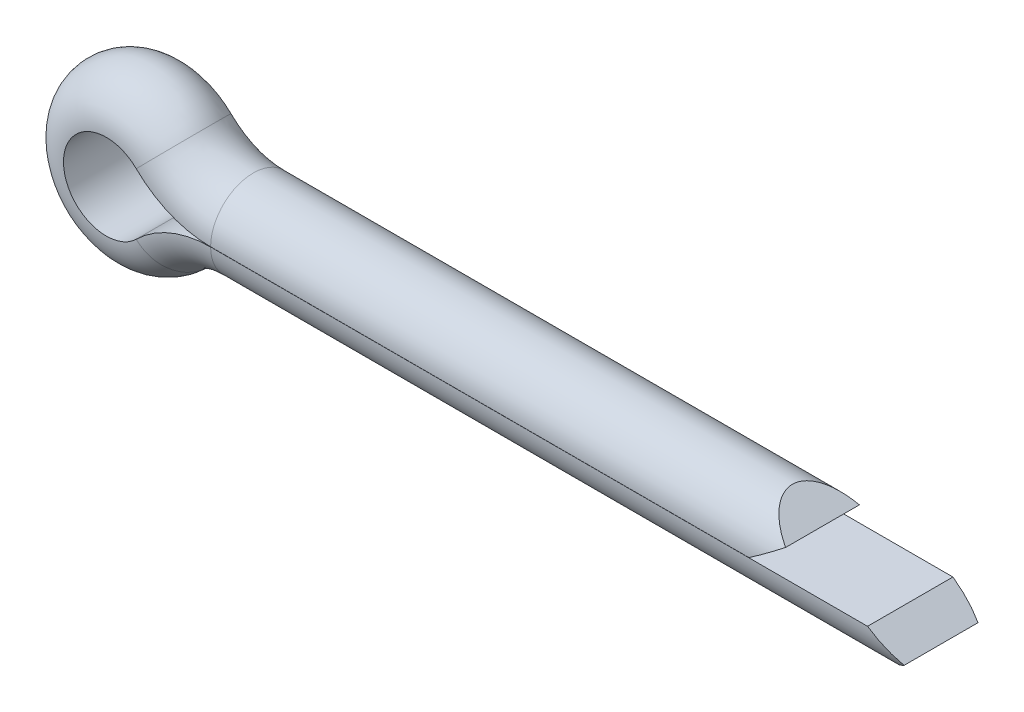
ISO-10303-21;
HEADER;
FILE_DESCRIPTION(('STEP AP214'),'2;1');
FILE_NAME('part.step','',(''),(''),'','','');
FILE_SCHEMA(('AUTOMOTIVE_DESIGN { 1 0 10303 214 1 1 1 1 }'));
ENDSEC;
DATA;
#1=APPLICATION_CONTEXT('core data for automotive mechanical design processes');
#2=APPLICATION_PROTOCOL_DEFINITION('international standard','automotive_design',2000,#1);
#3=PRODUCT_CONTEXT('',#1,'mechanical');
#4=PRODUCT('Part','Part','',(#3));
#5=PRODUCT_RELATED_PRODUCT_CATEGORY('part','',(#4));
#6=PRODUCT_DEFINITION_FORMATION('','',#4);
#7=PRODUCT_DEFINITION_CONTEXT('part definition',#1,'design');
#8=PRODUCT_DEFINITION('design','',#6,#7);
#9=PRODUCT_DEFINITION_SHAPE('','',#8);
#10=(LENGTH_UNIT() NAMED_UNIT(*) SI_UNIT(.MILLI.,.METRE.));
#11=(NAMED_UNIT(*) PLANE_ANGLE_UNIT() SI_UNIT($,.RADIAN.));
#12=(NAMED_UNIT(*) SI_UNIT($,.STERADIAN.) SOLID_ANGLE_UNIT());
#13=UNCERTAINTY_MEASURE_WITH_UNIT(LENGTH_MEASURE(1.E-05),#10,'distance_accuracy_value','');
#14=(GEOMETRIC_REPRESENTATION_CONTEXT(3) GLOBAL_UNCERTAINTY_ASSIGNED_CONTEXT((#13)) GLOBAL_UNIT_ASSIGNED_CONTEXT((#10,
#11,#12)) REPRESENTATION_CONTEXT('',''));
#15=CARTESIAN_POINT('',(0.,0.,0.));
#16=DIRECTION('',(0.,0.,1.));
#17=DIRECTION('',(1.,0.,0.));
#18=AXIS2_PLACEMENT_3D('',#15,#16,#17);
#19=CARTESIAN_POINT('',(0.,-0.00200000000000005,0.899997777775034));
#20=DIRECTION('',(0.,-1.,0.));
#21=DIRECTION('',(1.,0.,0.));
#22=AXIS2_PLACEMENT_3D('',#19,#20,#21);
#23=PLANE('',#22);
#24=DIRECTION('',(1.,0.,0.));
#25=VECTOR('',#24,1.);
#26=CARTESIAN_POINT('',(0.,-0.00200000000000005,0.899997777775034));
#27=LINE('',#26,#25);
#28=CARTESIAN_POINT('',(0.,-0.00200000000000005,0.899997777775034));
#29=VERTEX_POINT('',#28);
#30=CARTESIAN_POINT('',(13.8502858763282,-0.00200000000000167,0.899997777775034));
#31=VERTEX_POINT('',#30);
#32=EDGE_CURVE('E40',#29,#31,#27,.T.);
#33=ORIENTED_EDGE('',*,*,#32,.T.);
#34=DIRECTION('',(0.,0.,-1.));
#35=VECTOR('',#34,1.);
#36=CARTESIAN_POINT('',(13.8502858763282,-0.00200000000000026,0.899997777775034));
#37=LINE('',#36,#35);
#38=CARTESIAN_POINT('',(13.8502858763282,-0.00200000000000167,-0.899997777775034));
#39=VERTEX_POINT('',#38);
#40=EDGE_CURVE('E96',#31,#39,#37,.T.);
#41=ORIENTED_EDGE('',*,*,#40,.T.);
#42=DIRECTION('',(1.,0.,0.));
#43=VECTOR('',#42,1.);
#44=CARTESIAN_POINT('',(0.,-0.00200000000000005,-0.899997777775034));
#45=LINE('',#44,#43);
#46=CARTESIAN_POINT('',(0.,-0.00200000000000005,-0.899997777775034));
#47=VERTEX_POINT('',#46);
#48=EDGE_CURVE('E11',#47,#39,#45,.T.);
#49=ORIENTED_EDGE('',*,*,#48,.F.);
#50=DIRECTION('',(0.,0.,-1.));
#51=VECTOR('',#50,1.);
#52=CARTESIAN_POINT('',(0.,-0.00200000000000005,0.899997777775034));
#53=LINE('',#52,#51);
#54=EDGE_CURVE('E113',#29,#47,#53,.T.);
#55=ORIENTED_EDGE('',*,*,#54,.F.);
#56=EDGE_LOOP('',(#33,#41,#49,#55));
#57=FACE_BOUND('',#56,.T.);
#58=ADVANCED_FACE('F33',(#57),#23,.F.);
#59=CARTESIAN_POINT('',(0.,0.,0.));
#60=DIRECTION('',(1.,0.,0.));
#61=DIRECTION('',(0.,1.,0.));
#62=AXIS2_PLACEMENT_3D('',#59,#60,#61);
#63=CYLINDRICAL_SURFACE('',#62,0.9);
#64=CARTESIAN_POINT('',(15.1357297109468,0.,0.));
#65=DIRECTION('',(-0.578607904277823,0.815605844208601,0.));
#66=DIRECTION('',(0.815605844208601,0.578607904277824,0.));
#67=AXIS2_PLACEMENT_3D('',#64,#65,#66);
#68=ELLIPSE('',#67,1.55545749262329,0.9);
#69=CARTESIAN_POINT('',(14.5,-0.450999999999998,-0.778844657168554));
#70=VERTEX_POINT('',#69);
#71=CARTESIAN_POINT('',(14.5,-0.451,0.778844657168554));
#72=VERTEX_POINT('',#71);
#73=EDGE_CURVE('E110',#70,#72,#68,.T.);
#74=ORIENTED_EDGE('',*,*,#73,.T.);
#75=CARTESIAN_POINT('',(13.8473918267795,0.,0.));
#76=DIRECTION('',(-0.568523234922219,-0.822667205711748,0.));
#77=DIRECTION('',(0.822667205711748,-0.568523234922219,0.));
#78=AXIS2_PLACEMENT_3D('',#75,#76,#77);
#79=ELLIPSE('',#78,1.58304875635053,0.9);
#80=EDGE_CURVE('E99',#72,#31,#79,.T.);
#81=ORIENTED_EDGE('',*,*,#80,.T.);
#82=ORIENTED_EDGE('',*,*,#32,.F.);
#83=CARTESIAN_POINT('',(0.,0.,0.));
#84=DIRECTION('',(-1.,0.,0.));
#85=DIRECTION('',(0.,0.,-1.));
#86=AXIS2_PLACEMENT_3D('',#83,#84,#85);
#87=CIRCLE('',#86,0.9);
#88=EDGE_CURVE('E123',#47,#29,#87,.T.);
#89=ORIENTED_EDGE('',*,*,#88,.F.);
#90=ORIENTED_EDGE('',*,*,#48,.T.);
#91=EDGE_CURVE('E101',#39,#70,#79,.T.);
#92=ORIENTED_EDGE('',*,*,#91,.T.);
#93=EDGE_LOOP('',(#74,#81,#82,#89,#90,#92));
#94=FACE_BOUND('',#93,.T.);
#95=ADVANCED_FACE('F107',(#94),#63,.T.);
#96=CARTESIAN_POINT('',(0.,-2.23888888888889,0.));
#97=DIRECTION('',(0.,0.,-1.));
#98=DIRECTION('',(-1.,0.,0.));
#99=AXIS2_PLACEMENT_3D('',#96,#97,#98);
#100=CYLINDRICAL_SURFACE('',#99,2.23688888888889);
#101=DIRECTION('',(0.,0.,-1.));
#102=VECTOR('',#101,1.);
#103=CARTESIAN_POINT('',(-1.5678017699115,-0.643373451327425,0.899997777775034));
#104=LINE('',#103,#102);
#105=CARTESIAN_POINT('',(-1.5678017699115,-0.643373451327425,0.899997777775034));
#106=VERTEX_POINT('',#105);
#107=CARTESIAN_POINT('',(-1.5678017699115,-0.643373451327425,-0.899997777775034));
#108=VERTEX_POINT('',#107);
#109=EDGE_CURVE('E131',#106,#108,#104,.T.);
#110=ORIENTED_EDGE('',*,*,#109,.F.);
#111=CARTESIAN_POINT('',(0.,-2.23888888888889,0.899997777775034));
#112=DIRECTION('',(0.,0.,-1.));
#113=DIRECTION('',(-1.,0.,0.));
#114=AXIS2_PLACEMENT_3D('',#111,#112,#113);
#115=CIRCLE('',#114,2.23688888888889);
#116=EDGE_CURVE('E117',#106,#29,#115,.T.);
#117=ORIENTED_EDGE('',*,*,#116,.T.);
#118=ORIENTED_EDGE('',*,*,#54,.T.);
#119=CARTESIAN_POINT('',(0.,-2.23888888888889,-0.899997777775034));
#120=DIRECTION('',(0.,0.,-1.));
#121=DIRECTION('',(-1.,0.,0.));
#122=AXIS2_PLACEMENT_3D('',#119,#120,#121);
#123=CIRCLE('',#122,2.23688888888889);
#124=EDGE_CURVE('E115',#108,#47,#123,.T.);
#125=ORIENTED_EDGE('',*,*,#124,.F.);
#126=EDGE_LOOP('',(#110,#117,#118,#125));
#127=FACE_BOUND('',#126,.T.);
#128=ADVANCED_FACE('F196',(#127),#100,.T.);
#129=CARTESIAN_POINT('',(0.,-2.23888888888889,0.));
#130=DIRECTION('',(0.,0.,-1.));
#131=DIRECTION('',(-1.,0.,0.));
#132=AXIS2_PLACEMENT_3D('',#129,#130,#131);
#133=TOROIDAL_SURFACE('',#132,2.23888888888889,0.9);
#134=CARTESIAN_POINT('',(-1.569203539823,-0.641946902654858,0.));
#135=DIRECTION('',(-0.713274336283177,-0.700884955752222,0.));
#136=DIRECTION('',(0.,0.,-1.));
#137=AXIS2_PLACEMENT_3D('',#134,#135,#136);
#138=CIRCLE('',#137,0.9);
#139=EDGE_CURVE('E134',#108,#106,#138,.T.);
#140=ORIENTED_EDGE('',*,*,#139,.F.);
#141=ORIENTED_EDGE('',*,*,#124,.T.);
#142=ORIENTED_EDGE('',*,*,#88,.T.);
#143=ORIENTED_EDGE('',*,*,#116,.F.);
#144=EDGE_LOOP('',(#140,#141,#142,#143));
#145=FACE_BOUND('',#144,.T.);
#146=ADVANCED_FACE('F198',(#145),#133,.T.);
#147=CARTESIAN_POINT('',(-2.2,0.,0.));
#148=DIRECTION('',(0.,0.,1.));
#149=DIRECTION('',(1.,0.,0.));
#150=AXIS2_PLACEMENT_3D('',#147,#148,#149);
#151=CYLINDRICAL_SURFACE('',#150,0.902);
#152=DIRECTION('',(0.,0.,-1.));
#153=VECTOR('',#152,1.);
#154=CARTESIAN_POINT('',(-1.5678017699115,0.643373451327434,0.899997777775034));
#155=LINE('',#154,#153);
#156=CARTESIAN_POINT('',(-1.5678017699115,0.643373451327434,0.899997777775034));
#157=VERTEX_POINT('',#156);
#158=CARTESIAN_POINT('',(-1.5678017699115,0.643373451327434,-0.899997777775034));
#159=VERTEX_POINT('',#158);
#160=EDGE_CURVE('E143',#157,#159,#155,.T.);
#161=ORIENTED_EDGE('',*,*,#160,.F.);
#162=CARTESIAN_POINT('',(-2.2,0.,0.899997777775034));
#163=DIRECTION('',(0.,0.,1.));
#164=DIRECTION('',(1.,0.,0.));
#165=AXIS2_PLACEMENT_3D('',#162,#163,#164);
#166=CIRCLE('',#165,0.902);
#167=EDGE_CURVE('E128',#157,#106,#166,.T.);
#168=ORIENTED_EDGE('',*,*,#167,.T.);
#169=ORIENTED_EDGE('',*,*,#109,.T.);
#170=CARTESIAN_POINT('',(-2.2,0.,-0.899997777775034));
#171=DIRECTION('',(0.,0.,1.));
#172=DIRECTION('',(1.,0.,0.));
#173=AXIS2_PLACEMENT_3D('',#170,#171,#172);
#174=CIRCLE('',#173,0.902);
#175=EDGE_CURVE('E125',#159,#108,#174,.T.);
#176=ORIENTED_EDGE('',*,*,#175,.F.);
#177=EDGE_LOOP('',(#161,#168,#169,#176));
#178=FACE_BOUND('',#177,.T.);
#179=ADVANCED_FACE('F193',(#178),#151,.F.);
#180=CARTESIAN_POINT('',(-2.2,0.,0.));
#181=DIRECTION('',(0.,0.,1.));
#182=DIRECTION('',(1.,0.,0.));
#183=AXIS2_PLACEMENT_3D('',#180,#181,#182);
#184=TOROIDAL_SURFACE('',#183,0.9,0.9);
#185=CARTESIAN_POINT('',(-1.56920353982301,0.641946902654868,0.));
#186=DIRECTION('',(0.713274336283185,-0.700884955752213,0.));
#187=DIRECTION('',(0.,0.,-1.));
#188=AXIS2_PLACEMENT_3D('',#185,#186,#187);
#189=CIRCLE('',#188,0.9);
#190=EDGE_CURVE('E146',#159,#157,#189,.T.);
#191=ORIENTED_EDGE('',*,*,#190,.F.);
#192=ORIENTED_EDGE('',*,*,#175,.T.);
#193=ORIENTED_EDGE('',*,*,#139,.T.);
#194=ORIENTED_EDGE('',*,*,#167,.F.);
#195=EDGE_LOOP('',(#191,#192,#193,#194));
#196=FACE_BOUND('',#195,.T.);
#197=ADVANCED_FACE('F190',(#196),#184,.T.);
#198=CARTESIAN_POINT('',(0.,2.23888888888889,0.));
#199=DIRECTION('',(0.,0.,-1.));
#200=DIRECTION('',(-1.,0.,0.));
#201=AXIS2_PLACEMENT_3D('',#198,#199,#200);
#202=CYLINDRICAL_SURFACE('',#201,2.23688888888889);
#203=DIRECTION('',(0.,0.,-1.));
#204=VECTOR('',#203,1.);
#205=CARTESIAN_POINT('',(0.,0.002,0.899997777775034));
#206=LINE('',#205,#204);
#207=CARTESIAN_POINT('',(0.,0.002,0.899997777775034));
#208=VERTEX_POINT('',#207);
#209=CARTESIAN_POINT('',(0.,0.002,-0.899997777775034));
#210=VERTEX_POINT('',#209);
#211=EDGE_CURVE('E153',#208,#210,#206,.T.);
#212=ORIENTED_EDGE('',*,*,#211,.F.);
#213=CARTESIAN_POINT('',(0.,2.23888888888889,0.899997777775034));
#214=DIRECTION('',(0.,0.,-1.));
#215=DIRECTION('',(-1.,0.,0.));
#216=AXIS2_PLACEMENT_3D('',#213,#214,#215);
#217=CIRCLE('',#216,2.23688888888889);
#218=EDGE_CURVE('E140',#208,#157,#217,.T.);
#219=ORIENTED_EDGE('',*,*,#218,.T.);
#220=ORIENTED_EDGE('',*,*,#160,.T.);
#221=CARTESIAN_POINT('',(0.,2.23888888888889,-0.899997777775034));
#222=DIRECTION('',(0.,0.,-1.));
#223=DIRECTION('',(-1.,0.,0.));
#224=AXIS2_PLACEMENT_3D('',#221,#222,#223);
#225=CIRCLE('',#224,2.23688888888889);
#226=EDGE_CURVE('E137',#210,#159,#225,.T.);
#227=ORIENTED_EDGE('',*,*,#226,.F.);
#228=EDGE_LOOP('',(#212,#219,#220,#227));
#229=FACE_BOUND('',#228,.T.);
#230=ADVANCED_FACE('F184',(#229),#202,.T.);
#231=CARTESIAN_POINT('',(0.,2.23888888888889,0.));
#232=DIRECTION('',(0.,0.,-1.));
#233=DIRECTION('',(-1.,0.,0.));
#234=AXIS2_PLACEMENT_3D('',#231,#232,#233);
#235=TOROIDAL_SURFACE('',#234,2.23888888888889,0.9);
#236=CARTESIAN_POINT('',(0.,0.,0.));
#237=DIRECTION('',(1.,0.,0.));
#238=DIRECTION('',(0.,0.,-1.));
#239=AXIS2_PLACEMENT_3D('',#236,#237,#238);
#240=CIRCLE('',#239,0.9);
#241=EDGE_CURVE('E158',#210,#208,#240,.T.);
#242=ORIENTED_EDGE('',*,*,#241,.F.);
#243=ORIENTED_EDGE('',*,*,#226,.T.);
#244=ORIENTED_EDGE('',*,*,#190,.T.);
#245=ORIENTED_EDGE('',*,*,#218,.F.);
#246=EDGE_LOOP('',(#242,#243,#244,#245));
#247=FACE_BOUND('',#246,.T.);
#248=ADVANCED_FACE('F187',(#247),#235,.T.);
#249=CARTESIAN_POINT('',(0.,0.,0.));
#250=DIRECTION('',(1.,0.,0.));
#251=DIRECTION('',(0.,0.,-1.));
#252=AXIS2_PLACEMENT_3D('',#249,#250,#251);
#253=CYLINDRICAL_SURFACE('',#252,0.9);
#254=CARTESIAN_POINT('',(11.3473918267795,0.,0.));
#255=DIRECTION('',(-0.568523234922219,0.822667205711748,0.));
#256=DIRECTION('',(0.822667205711748,0.568523234922219,0.));
#257=AXIS2_PLACEMENT_3D('',#254,#255,#256);
#258=ELLIPSE('',#257,1.58304875635053,0.9);
#259=CARTESIAN_POINT('',(12.,0.451,0.778844657168553));
#260=VERTEX_POINT('',#259);
#261=CARTESIAN_POINT('',(11.3502858763282,0.002,0.899997777775034));
#262=VERTEX_POINT('',#261);
#263=EDGE_CURVE('E47',#260,#262,#258,.F.);
#264=ORIENTED_EDGE('',*,*,#263,.F.);
#265=CARTESIAN_POINT('',(12.6357297109468,0.,0.));
#266=DIRECTION('',(-0.578607904277824,-0.815605844208601,0.));
#267=DIRECTION('',(0.815605844208601,-0.578607904277824,0.));
#268=AXIS2_PLACEMENT_3D('',#265,#266,#267);
#269=ELLIPSE('',#268,1.55545749262329,0.9);
#270=CARTESIAN_POINT('',(12.,0.451,-0.778844657168553));
#271=VERTEX_POINT('',#270);
#272=EDGE_CURVE('E166',#271,#260,#269,.F.);
#273=ORIENTED_EDGE('',*,*,#272,.F.);
#274=CARTESIAN_POINT('',(11.3502858763282,0.00200000000000013,-0.899997777775034));
#275=VERTEX_POINT('',#274);
#276=EDGE_CURVE('E162',#275,#271,#258,.F.);
#277=ORIENTED_EDGE('',*,*,#276,.F.);
#278=DIRECTION('',(1.,0.,0.));
#279=VECTOR('',#278,1.);
#280=CARTESIAN_POINT('',(0.,0.002,-0.899997777775034));
#281=LINE('',#280,#279);
#282=EDGE_CURVE('E149',#210,#275,#281,.T.);
#283=ORIENTED_EDGE('',*,*,#282,.F.);
#284=ORIENTED_EDGE('',*,*,#241,.T.);
#285=DIRECTION('',(1.,0.,0.));
#286=VECTOR('',#285,1.);
#287=CARTESIAN_POINT('',(0.,0.002,0.899997777775034));
#288=LINE('',#287,#286);
#289=EDGE_CURVE('E150',#208,#262,#288,.T.);
#290=ORIENTED_EDGE('',*,*,#289,.T.);
#291=EDGE_LOOP('',(#264,#273,#277,#283,#284,#290));
#292=FACE_BOUND('',#291,.T.);
#293=ADVANCED_FACE('F176',(#292),#253,.T.);
#294=CARTESIAN_POINT('',(0.,0.002,0.899997777775034));
#295=DIRECTION('',(0.,-1.,0.));
#296=DIRECTION('',(0.,0.,-1.));
#297=AXIS2_PLACEMENT_3D('',#294,#295,#296);
#298=PLANE('',#297);
#299=DIRECTION('',(0.,0.,-1.));
#300=VECTOR('',#299,1.);
#301=CARTESIAN_POINT('',(11.3502858763281,0.002,0.899997777775034));
#302=LINE('',#301,#300);
#303=EDGE_CURVE('E164',#262,#275,#302,.T.);
#304=ORIENTED_EDGE('',*,*,#303,.F.);
#305=ORIENTED_EDGE('',*,*,#289,.F.);
#306=ORIENTED_EDGE('',*,*,#211,.T.);
#307=ORIENTED_EDGE('',*,*,#282,.T.);
#308=EDGE_LOOP('',(#304,#305,#306,#307));
#309=FACE_BOUND('',#308,.T.);
#310=ADVANCED_FACE('F181',(#309),#298,.T.);
#311=CARTESIAN_POINT('',(12.,0.451,-0.899997777775034));
#312=DIRECTION('',(-0.568523234922219,0.822667205711748,0.));
#313=DIRECTION('',(-0.822667205711748,-0.568523234922219,0.));
#314=AXIS2_PLACEMENT_3D('',#311,#312,#313);
#315=PLANE('',#314);
#316=ORIENTED_EDGE('',*,*,#263,.T.);
#317=ORIENTED_EDGE('',*,*,#303,.T.);
#318=ORIENTED_EDGE('',*,*,#276,.T.);
#319=DIRECTION('',(0.,0.,1.));
#320=VECTOR('',#319,1.);
#321=CARTESIAN_POINT('',(12.,0.451,-0.899997777775034));
#322=LINE('',#321,#320);
#323=EDGE_CURVE('E168',#271,#260,#322,.T.);
#324=ORIENTED_EDGE('',*,*,#323,.T.);
#325=EDGE_LOOP('',(#316,#317,#318,#324));
#326=FACE_BOUND('',#325,.T.);
#327=ADVANCED_FACE('F171',(#326),#315,.F.);
#328=CARTESIAN_POINT('',(12.,0.451,-0.899997777775034));
#329=DIRECTION('',(-0.578607904277824,-0.815605844208601,0.));
#330=DIRECTION('',(0.815605844208601,-0.578607904277824,0.));
#331=AXIS2_PLACEMENT_3D('',#328,#329,#330);
#332=PLANE('',#331);
#333=ORIENTED_EDGE('',*,*,#272,.T.);
#334=ORIENTED_EDGE('',*,*,#323,.F.);
#335=EDGE_LOOP('',(#333,#334));
#336=FACE_BOUND('',#335,.T.);
#337=ADVANCED_FACE('F277',(#336),#332,.F.);
#338=CARTESIAN_POINT('',(14.5,-0.451,-0.899997777775034));
#339=DIRECTION('',(-0.578607904277823,0.815605844208601,0.));
#340=DIRECTION('',(-0.815605844208601,-0.578607904277824,0.));
#341=AXIS2_PLACEMENT_3D('',#338,#339,#340);
#342=PLANE('',#341);
#343=DIRECTION('',(0.,0.,1.));
#344=VECTOR('',#343,1.);
#345=CARTESIAN_POINT('',(14.5,-0.451,-0.899997777775034));
#346=LINE('',#345,#344);
#347=EDGE_CURVE('E55',#70,#72,#346,.T.);
#348=ORIENTED_EDGE('',*,*,#347,.T.);
#349=ORIENTED_EDGE('',*,*,#73,.F.);
#350=EDGE_LOOP('',(#348,#349));
#351=FACE_BOUND('',#350,.T.);
#352=ADVANCED_FACE('F284',(#351),#342,.F.);
#353=CARTESIAN_POINT('',(14.5,-0.451,-0.899997777775034));
#354=DIRECTION('',(-0.568523234922219,-0.822667205711748,0.));
#355=DIRECTION('',(0.822667205711748,-0.568523234922219,0.));
#356=AXIS2_PLACEMENT_3D('',#353,#354,#355);
#357=PLANE('',#356);
#358=ORIENTED_EDGE('',*,*,#347,.F.);
#359=ORIENTED_EDGE('',*,*,#91,.F.);
#360=ORIENTED_EDGE('',*,*,#40,.F.);
#361=ORIENTED_EDGE('',*,*,#80,.F.);
#362=EDGE_LOOP('',(#358,#359,#360,#361));
#363=FACE_BOUND('',#362,.T.);
#364=ADVANCED_FACE('F98',(#363),#357,.F.);
#365=CLOSED_SHELL('',(#58,#95,#128,#146,#179,#197,#230,#248,#293,#310,#327,#337,#352,#364));
#366=MANIFOLD_SOLID_BREP('B2',#365);
#367=ADVANCED_BREP_SHAPE_REPRESENTATION('',(#18,#366),#14);
#368=SHAPE_DEFINITION_REPRESENTATION(#9,#367);
ENDSEC;
END-ISO-10303-21;
